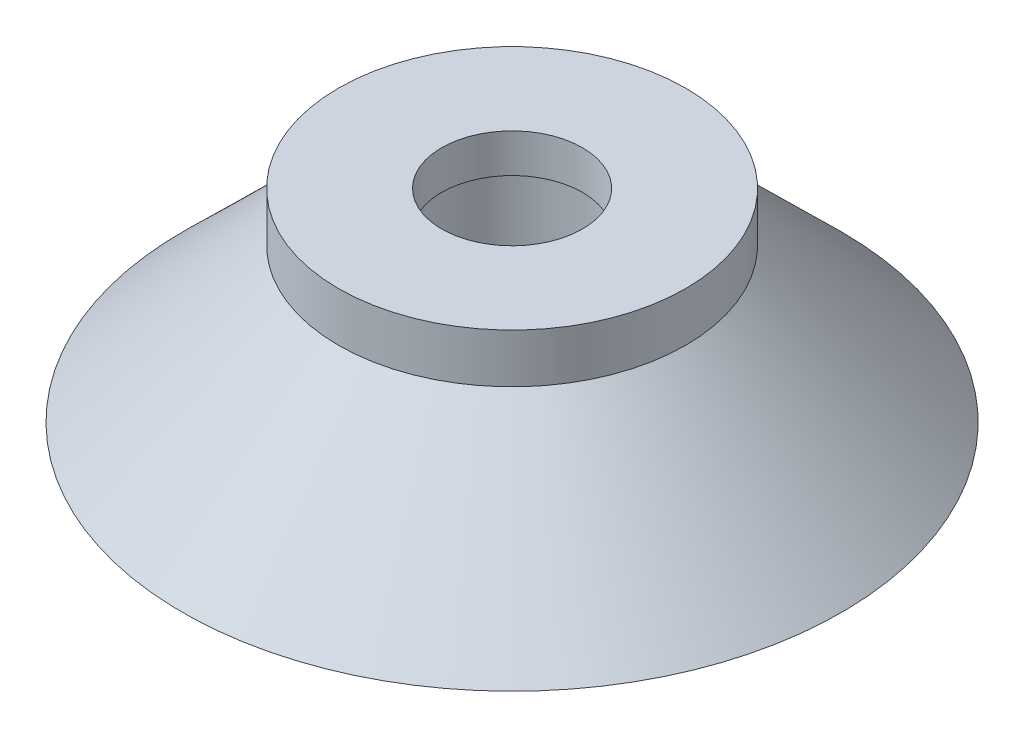
ISO-10303-21;
HEADER;
FILE_DESCRIPTION(('STEP AP214'),'2;1');
FILE_NAME('part.step','',(''),(''),'','','');
FILE_SCHEMA(('AUTOMOTIVE_DESIGN { 1 0 10303 214 1 1 1 1 }'));
ENDSEC;
DATA;
#1=APPLICATION_CONTEXT('core data for automotive mechanical design processes');
#2=APPLICATION_PROTOCOL_DEFINITION('international standard','automotive_design',2000,#1);
#3=PRODUCT_CONTEXT('',#1,'mechanical');
#4=PRODUCT('Part','Part','',(#3));
#5=PRODUCT_RELATED_PRODUCT_CATEGORY('part','',(#4));
#6=PRODUCT_DEFINITION_FORMATION('','',#4);
#7=PRODUCT_DEFINITION_CONTEXT('part definition',#1,'design');
#8=PRODUCT_DEFINITION('design','',#6,#7);
#9=PRODUCT_DEFINITION_SHAPE('','',#8);
#10=(LENGTH_UNIT() NAMED_UNIT(*) SI_UNIT(.MILLI.,.METRE.));
#11=(NAMED_UNIT(*) PLANE_ANGLE_UNIT() SI_UNIT($,.RADIAN.));
#12=(NAMED_UNIT(*) SI_UNIT($,.STERADIAN.) SOLID_ANGLE_UNIT());
#13=UNCERTAINTY_MEASURE_WITH_UNIT(LENGTH_MEASURE(1.E-05),#10,'distance_accuracy_value','');
#14=(GEOMETRIC_REPRESENTATION_CONTEXT(3) GLOBAL_UNCERTAINTY_ASSIGNED_CONTEXT((#13)) GLOBAL_UNIT_ASSIGNED_CONTEXT((#10,
#11,#12)) REPRESENTATION_CONTEXT('',''));
#15=CARTESIAN_POINT('',(0.,0.,0.));
#16=DIRECTION('',(0.,0.,1.));
#17=DIRECTION('',(1.,0.,0.));
#18=AXIS2_PLACEMENT_3D('',#15,#16,#17);
#19=CARTESIAN_POINT('',(0.,7.85,-2.73));
#20=DIRECTION('',(0.,1.,0.));
#21=DIRECTION('',(0.,0.,1.));
#22=AXIS2_PLACEMENT_3D('',#19,#20,#21);
#23=PLANE('',#22);
#24=CARTESIAN_POINT('',(0.,7.85,0.));
#25=DIRECTION('',(0.,-1.,0.));
#26=DIRECTION('',(0.,0.,-1.));
#27=AXIS2_PLACEMENT_3D('',#24,#25,#26);
#28=CIRCLE('',#27,2.73);
#29=CARTESIAN_POINT('',(0.,7.85,-2.73));
#30=VERTEX_POINT('',#29);
#31=EDGE_CURVE('E61',#30,#30,#28,.T.);
#32=ORIENTED_EDGE('',*,*,#31,.T.);
#33=EDGE_LOOP('',(#32));
#34=FACE_BOUND('',#33,.T.);
#35=CARTESIAN_POINT('',(0.,7.85,0.));
#36=DIRECTION('',(0.,-1.,0.));
#37=DIRECTION('',(0.,0.,-1.));
#38=AXIS2_PLACEMENT_3D('',#35,#36,#37);
#39=CIRCLE('',#38,6.73);
#40=CARTESIAN_POINT('',(0.,7.85,-6.73));
#41=VERTEX_POINT('',#40);
#42=EDGE_CURVE('E10',#41,#41,#39,.T.);
#43=ORIENTED_EDGE('',*,*,#42,.F.);
#44=EDGE_LOOP('',(#43));
#45=FACE_BOUND('',#44,.T.);
#46=ADVANCED_FACE('F40',(#34,#45),#23,.T.);
#47=CARTESIAN_POINT('',(0.,0.,0.));
#48=DIRECTION('',(0.,-1.,0.));
#49=DIRECTION('',(0.,0.,-1.));
#50=AXIS2_PLACEMENT_3D('',#47,#48,#49);
#51=CYLINDRICAL_SURFACE('',#50,6.73);
#52=ORIENTED_EDGE('',*,*,#42,.T.);
#53=EDGE_LOOP('',(#52));
#54=FACE_BOUND('',#53,.T.);
#55=CARTESIAN_POINT('',(0.,5.945,0.));
#56=DIRECTION('',(0.,-1.,0.));
#57=DIRECTION('',(0.,0.,-1.));
#58=AXIS2_PLACEMENT_3D('',#55,#56,#57);
#59=CIRCLE('',#58,6.73);
#60=CARTESIAN_POINT('',(0.,5.945,-6.73));
#61=VERTEX_POINT('',#60);
#62=EDGE_CURVE('E43',#61,#61,#59,.T.);
#63=ORIENTED_EDGE('',*,*,#62,.F.);
#64=EDGE_LOOP('',(#63));
#65=FACE_BOUND('',#64,.T.);
#66=ADVANCED_FACE('F77',(#54,#65),#51,.T.);
#67=CARTESIAN_POINT('',(0.,0.,0.));
#68=DIRECTION('',(0.,-1.,0.));
#69=DIRECTION('',(0.,0.,-1.));
#70=AXIS2_PLACEMENT_3D('',#67,#68,#69);
#71=CONICAL_SURFACE('',#70,12.7762,0.79383748535254);
#72=ORIENTED_EDGE('',*,*,#62,.T.);
#73=EDGE_LOOP('',(#72));
#74=FACE_BOUND('',#73,.T.);
#75=CARTESIAN_POINT('',(0.,0.,0.));
#76=DIRECTION('',(0.,-1.,0.));
#77=DIRECTION('',(0.,0.,-1.));
#78=AXIS2_PLACEMENT_3D('',#75,#76,#77);
#79=CIRCLE('',#78,12.7762);
#80=CARTESIAN_POINT('',(0.,0.,-12.7762));
#81=VERTEX_POINT('',#80);
#82=EDGE_CURVE('E50',#81,#81,#79,.T.);
#83=ORIENTED_EDGE('',*,*,#82,.F.);
#84=EDGE_LOOP('',(#83));
#85=FACE_BOUND('',#84,.T.);
#86=ADVANCED_FACE('F83',(#74,#85),#71,.T.);
#87=CARTESIAN_POINT('',(0.,0.,-12.7762));
#88=DIRECTION('',(0.,-1.,0.));
#89=DIRECTION('',(0.,0.,-1.));
#90=AXIS2_PLACEMENT_3D('',#87,#88,#89);
#91=PLANE('',#90);
#92=ORIENTED_EDGE('',*,*,#82,.T.);
#93=EDGE_LOOP('',(#92));
#94=FACE_BOUND('',#93,.T.);
#95=CARTESIAN_POINT('',(0.,0.,0.));
#96=DIRECTION('',(0.,-1.,0.));
#97=DIRECTION('',(0.,0.,-1.));
#98=AXIS2_PLACEMENT_3D('',#95,#96,#97);
#99=CIRCLE('',#98,3.2);
#100=CARTESIAN_POINT('',(0.,0.,-3.2));
#101=VERTEX_POINT('',#100);
#102=EDGE_CURVE('E51',#101,#101,#99,.T.);
#103=ORIENTED_EDGE('',*,*,#102,.F.);
#104=EDGE_LOOP('',(#103));
#105=FACE_BOUND('',#104,.T.);
#106=ADVANCED_FACE('F86',(#94,#105),#91,.T.);
#107=CARTESIAN_POINT('',(0.,0.,0.));
#108=DIRECTION('',(0.,-1.,0.));
#109=DIRECTION('',(0.,0.,-1.));
#110=AXIS2_PLACEMENT_3D('',#107,#108,#109);
#111=CYLINDRICAL_SURFACE('',#110,3.2);
#112=ORIENTED_EDGE('',*,*,#102,.T.);
#113=EDGE_LOOP('',(#112));
#114=FACE_BOUND('',#113,.T.);
#115=CARTESIAN_POINT('',(0.,6.35,0.));
#116=DIRECTION('',(0.,-1.,0.));
#117=DIRECTION('',(0.,0.,-1.));
#118=AXIS2_PLACEMENT_3D('',#115,#116,#117);
#119=CIRCLE('',#118,3.2);
#120=CARTESIAN_POINT('',(0.,6.35,-3.2));
#121=VERTEX_POINT('',#120);
#122=EDGE_CURVE('E57',#121,#121,#119,.T.);
#123=ORIENTED_EDGE('',*,*,#122,.F.);
#124=EDGE_LOOP('',(#123));
#125=FACE_BOUND('',#124,.T.);
#126=ADVANCED_FACE('F79',(#114,#125),#111,.F.);
#127=CARTESIAN_POINT('',(0.,6.35,-2.73));
#128=DIRECTION('',(0.,-1.,0.));
#129=DIRECTION('',(0.,0.,-1.));
#130=AXIS2_PLACEMENT_3D('',#127,#128,#129);
#131=PLANE('',#130);
#132=ORIENTED_EDGE('',*,*,#122,.T.);
#133=EDGE_LOOP('',(#132));
#134=FACE_BOUND('',#133,.T.);
#135=CARTESIAN_POINT('',(0.,6.35,0.));
#136=DIRECTION('',(0.,-1.,0.));
#137=DIRECTION('',(0.,0.,-1.));
#138=AXIS2_PLACEMENT_3D('',#135,#136,#137);
#139=CIRCLE('',#138,2.73);
#140=CARTESIAN_POINT('',(0.,6.35,-2.73));
#141=VERTEX_POINT('',#140);
#142=EDGE_CURVE('E56',#141,#141,#139,.T.);
#143=ORIENTED_EDGE('',*,*,#142,.F.);
#144=EDGE_LOOP('',(#143));
#145=FACE_BOUND('',#144,.T.);
#146=ADVANCED_FACE('F70',(#134,#145),#131,.T.);
#147=CARTESIAN_POINT('',(0.,0.,0.));
#148=DIRECTION('',(0.,-1.,0.));
#149=DIRECTION('',(0.,0.,-1.));
#150=AXIS2_PLACEMENT_3D('',#147,#148,#149);
#151=CYLINDRICAL_SURFACE('',#150,2.73);
#152=ORIENTED_EDGE('',*,*,#142,.T.);
#153=EDGE_LOOP('',(#152));
#154=FACE_BOUND('',#153,.T.);
#155=ORIENTED_EDGE('',*,*,#31,.F.);
#156=EDGE_LOOP('',(#155));
#157=FACE_BOUND('',#156,.T.);
#158=ADVANCED_FACE('F69',(#154,#157),#151,.F.);
#159=CLOSED_SHELL('',(#46,#66,#86,#106,#126,#146,#158));
#160=MANIFOLD_SOLID_BREP('B2',#159);
#161=ADVANCED_BREP_SHAPE_REPRESENTATION('',(#18,#160),#14);
#162=SHAPE_DEFINITION_REPRESENTATION(#9,#161);
ENDSEC;
END-ISO-10303-21;
